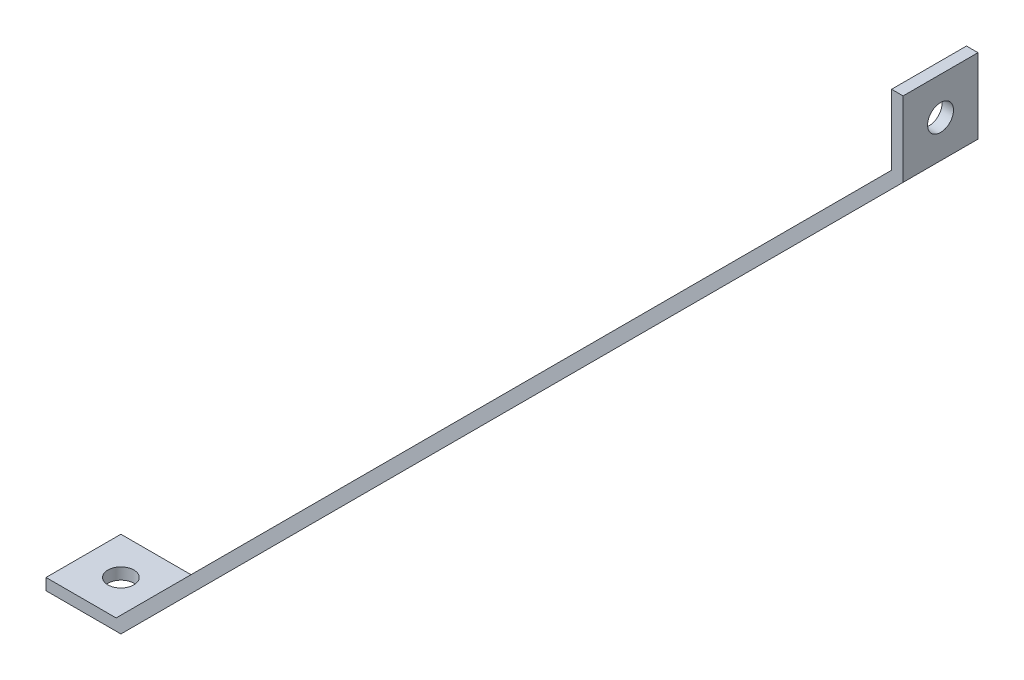
ISO-10303-21;
HEADER;
FILE_DESCRIPTION(('STEP AP214'),'2;1');
FILE_NAME('part.step','',(''),(''),'','','');
FILE_SCHEMA(('AUTOMOTIVE_DESIGN { 1 0 10303 214 1 1 1 1 }'));
ENDSEC;
DATA;
#1=APPLICATION_CONTEXT('core data for automotive mechanical design processes');
#2=APPLICATION_PROTOCOL_DEFINITION('international standard','automotive_design',2000,#1);
#3=PRODUCT_CONTEXT('',#1,'mechanical');
#4=PRODUCT('Part','Part','',(#3));
#5=PRODUCT_RELATED_PRODUCT_CATEGORY('part','',(#4));
#6=PRODUCT_DEFINITION_FORMATION('','',#4);
#7=PRODUCT_DEFINITION_CONTEXT('part definition',#1,'design');
#8=PRODUCT_DEFINITION('design','',#6,#7);
#9=PRODUCT_DEFINITION_SHAPE('','',#8);
#10=(LENGTH_UNIT() NAMED_UNIT(*) SI_UNIT(.MILLI.,.METRE.));
#11=(NAMED_UNIT(*) PLANE_ANGLE_UNIT() SI_UNIT($,.RADIAN.));
#12=(NAMED_UNIT(*) SI_UNIT($,.STERADIAN.) SOLID_ANGLE_UNIT());
#13=UNCERTAINTY_MEASURE_WITH_UNIT(LENGTH_MEASURE(1.E-05),#10,'distance_accuracy_value','');
#14=(GEOMETRIC_REPRESENTATION_CONTEXT(3) GLOBAL_UNCERTAINTY_ASSIGNED_CONTEXT((#13)) GLOBAL_UNIT_ASSIGNED_CONTEXT((#10,
#11,#12)) REPRESENTATION_CONTEXT('',''));
#15=CARTESIAN_POINT('',(0.,0.,0.));
#16=DIRECTION('',(0.,0.,1.));
#17=DIRECTION('',(1.,0.,0.));
#18=AXIS2_PLACEMENT_3D('',#15,#16,#17);
#19=CARTESIAN_POINT('',(215.526146905661,215.52614690566,20.6374999999994));
#20=DIRECTION('',(-0.999999999999998,0.,0.));
#21=DIRECTION('',(0.,0.,1.));
#22=AXIS2_PLACEMENT_3D('',#19,#20,#21);
#23=PLANE('',#22);
#24=CARTESIAN_POINT('',(215.52614690566,236.163646905659,-4.44089209850063E-13));
#25=DIRECTION('',(-0.999999999999998,0.,0.));
#26=DIRECTION('',(0.,-0.999999999999998,0.));
#27=AXIS2_PLACEMENT_3D('',#24,#25,#26);
#28=CIRCLE('',#27,7.14374999999999);
#29=CARTESIAN_POINT('',(215.52614690566,229.019896905659,-4.44089209850061E-13));
#30=VERTEX_POINT('',#29);
#31=EDGE_CURVE('E180',#30,#30,#28,.T.);
#32=ORIENTED_EDGE('',*,*,#31,.T.);
#33=EDGE_LOOP('',(#32));
#34=FACE_BOUND('',#33,.T.);
#35=DIRECTION('',(0.,0.999999999999998,0.));
#36=VECTOR('',#35,1.);
#37=CARTESIAN_POINT('',(215.52614690566,215.526146905659,-20.6375000000003));
#38=LINE('',#37,#36);
#39=CARTESIAN_POINT('',(215.52614690566,215.526146905659,-20.6375000000003));
#40=VERTEX_POINT('',#39);
#41=CARTESIAN_POINT('',(215.52614690566,256.801146905659,-20.6375000000003));
#42=VERTEX_POINT('',#41);
#43=EDGE_CURVE('E129',#40,#42,#38,.T.);
#44=ORIENTED_EDGE('',*,*,#43,.T.);
#45=DIRECTION('',(0.,0.,-1.));
#46=VECTOR('',#45,1.);
#47=CARTESIAN_POINT('',(215.526146905661,256.801146905659,20.6374999999994));
#48=LINE('',#47,#46);
#49=CARTESIAN_POINT('',(215.526146905661,256.801146905659,20.6374999999994));
#50=VERTEX_POINT('',#49);
#51=EDGE_CURVE('E11',#50,#42,#48,.T.);
#52=ORIENTED_EDGE('',*,*,#51,.F.);
#53=DIRECTION('',(0.,0.999999999999998,0.));
#54=VECTOR('',#53,1.);
#55=CARTESIAN_POINT('',(215.526146905661,215.52614690566,20.6374999999994));
#56=LINE('',#55,#54);
#57=CARTESIAN_POINT('',(215.526146905661,215.52614690566,20.6374999999994));
#58=VERTEX_POINT('',#57);
#59=EDGE_CURVE('E87',#58,#50,#56,.T.);
#60=ORIENTED_EDGE('',*,*,#59,.F.);
#61=DIRECTION('',(0.,0.,-1.));
#62=VECTOR('',#61,1.);
#63=CARTESIAN_POINT('',(215.526146905661,215.52614690566,20.6374999999994));
#64=LINE('',#63,#62);
#65=EDGE_CURVE('E128',#58,#40,#64,.T.);
#66=ORIENTED_EDGE('',*,*,#65,.T.);
#67=EDGE_LOOP('',(#44,#52,#60,#66));
#68=FACE_BOUND('',#67,.T.);
#69=ADVANCED_FACE('F32',(#34,#68),#23,.F.);
#70=CARTESIAN_POINT('',(209.176146905661,256.801146905659,20.6374999999999));
#71=DIRECTION('',(0.,0.999999999999998,0.));
#72=DIRECTION('',(0.,0.,1.));
#73=AXIS2_PLACEMENT_3D('',#70,#71,#72);
#74=PLANE('',#73);
#75=DIRECTION('',(0.999999999999998,0.,0.));
#76=VECTOR('',#75,1.);
#77=CARTESIAN_POINT('',(209.176146905659,256.801146905659,-20.6375000000003));
#78=LINE('',#77,#76);
#79=CARTESIAN_POINT('',(209.176146905659,256.801146905659,-20.6375000000003));
#80=VERTEX_POINT('',#79);
#81=EDGE_CURVE('E132',#80,#42,#78,.T.);
#82=ORIENTED_EDGE('',*,*,#81,.F.);
#83=DIRECTION('',(0.,0.,-1.));
#84=VECTOR('',#83,1.);
#85=CARTESIAN_POINT('',(209.176146905661,256.801146905659,20.6374999999999));
#86=LINE('',#85,#84);
#87=CARTESIAN_POINT('',(209.176146905661,256.801146905659,20.6374999999999));
#88=VERTEX_POINT('',#87);
#89=EDGE_CURVE('E40',#88,#80,#86,.T.);
#90=ORIENTED_EDGE('',*,*,#89,.F.);
#91=DIRECTION('',(0.999999999999998,0.,0.));
#92=VECTOR('',#91,1.);
#93=CARTESIAN_POINT('',(209.176146905661,256.801146905659,20.6374999999999));
#94=LINE('',#93,#92);
#95=EDGE_CURVE('E172',#88,#50,#94,.T.);
#96=ORIENTED_EDGE('',*,*,#95,.T.);
#97=ORIENTED_EDGE('',*,*,#51,.T.);
#98=EDGE_LOOP('',(#82,#90,#96,#97));
#99=FACE_BOUND('',#98,.T.);
#100=ADVANCED_FACE('F163',(#99),#74,.T.);
#101=CARTESIAN_POINT('',(209.176146905661,215.52614690566,20.6374999999999));
#102=DIRECTION('',(-0.999999999999998,0.,0.));
#103=DIRECTION('',(0.,0.,1.));
#104=AXIS2_PLACEMENT_3D('',#101,#102,#103);
#105=PLANE('',#104);
#106=CARTESIAN_POINT('',(209.176146905659,236.163646905659,-4.44089209850063E-13));
#107=DIRECTION('',(-0.999999999999998,0.,0.));
#108=DIRECTION('',(0.,-0.999999999999998,0.));
#109=AXIS2_PLACEMENT_3D('',#106,#107,#108);
#110=CIRCLE('',#109,7.14374999999999);
#111=CARTESIAN_POINT('',(209.176146905659,229.019896905659,-4.44089209850061E-13));
#112=VERTEX_POINT('',#111);
#113=EDGE_CURVE('E183',#112,#112,#110,.T.);
#114=ORIENTED_EDGE('',*,*,#113,.F.);
#115=EDGE_LOOP('',(#114));
#116=FACE_BOUND('',#115,.T.);
#117=DIRECTION('',(0.,0.999999999999998,0.));
#118=VECTOR('',#117,1.);
#119=CARTESIAN_POINT('',(209.176146905659,215.526146905659,-20.6375000000003));
#120=LINE('',#119,#118);
#121=CARTESIAN_POINT('',(209.176146905659,218.156403026728,-20.6375000000003));
#122=VERTEX_POINT('',#121);
#123=EDGE_CURVE('E136',#122,#80,#120,.T.);
#124=ORIENTED_EDGE('',*,*,#123,.F.);
#125=DIRECTION('',(0.,0.,-1.));
#126=VECTOR('',#125,1.);
#127=CARTESIAN_POINT('',(209.176146905661,218.156403026729,20.6374999999999));
#128=LINE('',#127,#126);
#129=CARTESIAN_POINT('',(209.176146905661,218.156403026729,20.6374999999999));
#130=VERTEX_POINT('',#129);
#131=EDGE_CURVE('E153',#130,#122,#128,.T.);
#132=ORIENTED_EDGE('',*,*,#131,.F.);
#133=DIRECTION('',(0.,0.999999999999998,0.));
#134=VECTOR('',#133,1.);
#135=CARTESIAN_POINT('',(209.176146905661,215.52614690566,20.6374999999999));
#136=LINE('',#135,#134);
#137=EDGE_CURVE('E160',#130,#88,#136,.T.);
#138=ORIENTED_EDGE('',*,*,#137,.T.);
#139=ORIENTED_EDGE('',*,*,#89,.T.);
#140=EDGE_LOOP('',(#124,#132,#138,#139));
#141=FACE_BOUND('',#140,.T.);
#142=ADVANCED_FACE('F158',(#116,#141),#105,.T.);
#143=CARTESIAN_POINT('',(-220.016274966192,-211.036018845125,20.6374999999999));
#144=DIRECTION('',(-0.707106781186548,0.707106781186545,0.));
#145=DIRECTION('',(-0.707106781186545,-0.707106781186548,0.));
#146=AXIS2_PLACEMENT_3D('',#143,#144,#145);
#147=PLANE('',#146);
#148=DIRECTION('',(0.707106781186545,0.707106781186548,0.));
#149=VECTOR('',#148,1.);
#150=CARTESIAN_POINT('',(-220.016274966194,-211.036018845125,-20.6374999999999));
#151=LINE('',#150,#149);
#152=CARTESIAN_POINT('',(-218.156403026728,-209.17614690566,-20.6374999999994));
#153=VERTEX_POINT('',#152);
#154=EDGE_CURVE('E139',#153,#122,#151,.T.);
#155=ORIENTED_EDGE('',*,*,#154,.F.);
#156=DIRECTION('',(0.,0.,-1.));
#157=VECTOR('',#156,1.);
#158=CARTESIAN_POINT('',(-218.156403026727,-209.17614690566,20.6375000000003));
#159=LINE('',#158,#157);
#160=CARTESIAN_POINT('',(-218.156403026727,-209.17614690566,20.6375000000003));
#161=VERTEX_POINT('',#160);
#162=EDGE_CURVE('E151',#161,#153,#159,.T.);
#163=ORIENTED_EDGE('',*,*,#162,.F.);
#164=DIRECTION('',(0.707106781186545,0.707106781186548,0.));
#165=VECTOR('',#164,1.);
#166=CARTESIAN_POINT('',(-220.016274966192,-211.036018845125,20.6374999999999));
#167=LINE('',#166,#165);
#168=EDGE_CURVE('E123',#161,#130,#167,.T.);
#169=ORIENTED_EDGE('',*,*,#168,.T.);
#170=ORIENTED_EDGE('',*,*,#131,.T.);
#171=EDGE_LOOP('',(#155,#163,#169,#170));
#172=FACE_BOUND('',#171,.T.);
#173=ADVANCED_FACE('F170',(#172),#147,.T.);
#174=CARTESIAN_POINT('',(-256.801146905658,-209.17614690566,20.6375000000003));
#175=DIRECTION('',(0.,0.999999999999998,0.));
#176=DIRECTION('',(-0.999999999999998,0.,0.));
#177=AXIS2_PLACEMENT_3D('',#174,#175,#176);
#178=PLANE('',#177);
#179=CARTESIAN_POINT('',(-236.163646905659,-209.17614690566,-4.44089209850063E-13));
#180=DIRECTION('',(0.,0.999999999999998,0.));
#181=DIRECTION('',(0.,0.,1.));
#182=AXIS2_PLACEMENT_3D('',#179,#180,#181);
#183=CIRCLE('',#182,7.14375000000002);
#184=CARTESIAN_POINT('',(-236.163646905659,-209.17614690566,7.14374999999957));
#185=VERTEX_POINT('',#184);
#186=EDGE_CURVE('E177',#185,#185,#183,.T.);
#187=ORIENTED_EDGE('',*,*,#186,.F.);
#188=EDGE_LOOP('',(#187));
#189=FACE_BOUND('',#188,.T.);
#190=DIRECTION('',(0.999999999999998,0.,0.));
#191=VECTOR('',#190,1.);
#192=CARTESIAN_POINT('',(-256.801146905659,-209.17614690566,-20.6374999999999));
#193=LINE('',#192,#191);
#194=CARTESIAN_POINT('',(-256.801146905659,-209.17614690566,-20.6374999999999));
#195=VERTEX_POINT('',#194);
#196=EDGE_CURVE('E142',#195,#153,#193,.T.);
#197=ORIENTED_EDGE('',*,*,#196,.F.);
#198=DIRECTION('',(0.,0.,-1.));
#199=VECTOR('',#198,1.);
#200=CARTESIAN_POINT('',(-256.801146905658,-209.17614690566,20.6375000000003));
#201=LINE('',#200,#199);
#202=CARTESIAN_POINT('',(-256.801146905658,-209.17614690566,20.6375000000003));
#203=VERTEX_POINT('',#202);
#204=EDGE_CURVE('E111',#203,#195,#201,.T.);
#205=ORIENTED_EDGE('',*,*,#204,.F.);
#206=DIRECTION('',(0.999999999999998,0.,0.));
#207=VECTOR('',#206,1.);
#208=CARTESIAN_POINT('',(-256.801146905658,-209.17614690566,20.6375000000003));
#209=LINE('',#208,#207);
#210=EDGE_CURVE('E121',#203,#161,#209,.T.);
#211=ORIENTED_EDGE('',*,*,#210,.T.);
#212=ORIENTED_EDGE('',*,*,#162,.T.);
#213=EDGE_LOOP('',(#197,#205,#211,#212));
#214=FACE_BOUND('',#213,.T.);
#215=ADVANCED_FACE('F204',(#189,#214),#178,.T.);
#216=CARTESIAN_POINT('',(-256.801146905658,-215.52614690566,20.6375000000003));
#217=DIRECTION('',(-0.999999999999998,0.,0.));
#218=DIRECTION('',(0.,0.,1.));
#219=AXIS2_PLACEMENT_3D('',#216,#217,#218);
#220=PLANE('',#219);
#221=DIRECTION('',(0.,0.999999999999998,0.));
#222=VECTOR('',#221,1.);
#223=CARTESIAN_POINT('',(-256.801146905659,-215.52614690566,-20.6374999999999));
#224=LINE('',#223,#222);
#225=CARTESIAN_POINT('',(-256.801146905659,-215.52614690566,-20.6374999999999));
#226=VERTEX_POINT('',#225);
#227=EDGE_CURVE('E110',#226,#195,#224,.T.);
#228=ORIENTED_EDGE('',*,*,#227,.F.);
#229=DIRECTION('',(0.,0.,-1.));
#230=VECTOR('',#229,1.);
#231=CARTESIAN_POINT('',(-256.801146905658,-215.52614690566,20.6375000000003));
#232=LINE('',#231,#230);
#233=CARTESIAN_POINT('',(-256.801146905658,-215.52614690566,20.6375000000003));
#234=VERTEX_POINT('',#233);
#235=EDGE_CURVE('E104',#234,#226,#232,.T.);
#236=ORIENTED_EDGE('',*,*,#235,.F.);
#237=DIRECTION('',(0.,0.999999999999998,0.));
#238=VECTOR('',#237,1.);
#239=CARTESIAN_POINT('',(-256.801146905658,-215.52614690566,20.6375000000003));
#240=LINE('',#239,#238);
#241=EDGE_CURVE('E108',#234,#203,#240,.T.);
#242=ORIENTED_EDGE('',*,*,#241,.T.);
#243=ORIENTED_EDGE('',*,*,#204,.T.);
#244=EDGE_LOOP('',(#228,#236,#242,#243));
#245=FACE_BOUND('',#244,.T.);
#246=ADVANCED_FACE('F106',(#245),#220,.T.);
#247=CARTESIAN_POINT('',(-256.801146905658,-215.52614690566,20.6375000000003));
#248=DIRECTION('',(0.,0.999999999999998,0.));
#249=DIRECTION('',(-0.999999999999998,0.,0.));
#250=AXIS2_PLACEMENT_3D('',#247,#248,#249);
#251=PLANE('',#250);
#252=CARTESIAN_POINT('',(-236.163646905659,-215.52614690566,-4.44089209850063E-13));
#253=DIRECTION('',(0.,0.999999999999998,0.));
#254=DIRECTION('',(0.,0.,1.));
#255=AXIS2_PLACEMENT_3D('',#252,#253,#254);
#256=CIRCLE('',#255,7.14375000000002);
#257=CARTESIAN_POINT('',(-236.163646905659,-215.52614690566,7.14374999999957));
#258=VERTEX_POINT('',#257);
#259=EDGE_CURVE('E133',#258,#258,#256,.T.);
#260=ORIENTED_EDGE('',*,*,#259,.T.);
#261=EDGE_LOOP('',(#260));
#262=FACE_BOUND('',#261,.T.);
#263=DIRECTION('',(0.999999999999998,0.,0.));
#264=VECTOR('',#263,1.);
#265=CARTESIAN_POINT('',(-256.801146905659,-215.52614690566,-20.6374999999999));
#266=LINE('',#265,#264);
#267=CARTESIAN_POINT('',(-215.526146905659,-215.52614690566,-20.6374999999994));
#268=VERTEX_POINT('',#267);
#269=EDGE_CURVE('E75',#226,#268,#266,.T.);
#270=ORIENTED_EDGE('',*,*,#269,.T.);
#271=DIRECTION('',(0.,0.,-1.));
#272=VECTOR('',#271,1.);
#273=CARTESIAN_POINT('',(-215.526146905658,-215.52614690566,20.6375000000003));
#274=LINE('',#273,#272);
#275=CARTESIAN_POINT('',(-215.526146905658,-215.52614690566,20.6375000000003));
#276=VERTEX_POINT('',#275);
#277=EDGE_CURVE('E112',#276,#268,#274,.T.);
#278=ORIENTED_EDGE('',*,*,#277,.F.);
#279=DIRECTION('',(0.999999999999998,0.,0.));
#280=VECTOR('',#279,1.);
#281=CARTESIAN_POINT('',(-256.801146905658,-215.52614690566,20.6375000000003));
#282=LINE('',#281,#280);
#283=EDGE_CURVE('E114',#234,#276,#282,.T.);
#284=ORIENTED_EDGE('',*,*,#283,.F.);
#285=ORIENTED_EDGE('',*,*,#235,.T.);
#286=EDGE_LOOP('',(#270,#278,#284,#285));
#287=FACE_BOUND('',#286,.T.);
#288=ADVANCED_FACE('F115',(#262,#287),#251,.F.);
#289=CARTESIAN_POINT('',(-215.526146905658,-215.52614690566,20.6375000000003));
#290=DIRECTION('',(-0.707106781186548,0.707106781186545,0.));
#291=DIRECTION('',(-0.707106781186545,-0.707106781186548,0.));
#292=AXIS2_PLACEMENT_3D('',#289,#290,#291);
#293=PLANE('',#292);
#294=DIRECTION('',(0.707106781186545,0.707106781186548,0.));
#295=VECTOR('',#294,1.);
#296=CARTESIAN_POINT('',(-215.526146905659,-215.52614690566,-20.6374999999994));
#297=LINE('',#296,#295);
#298=EDGE_CURVE('E81',#268,#40,#297,.T.);
#299=ORIENTED_EDGE('',*,*,#298,.T.);
#300=ORIENTED_EDGE('',*,*,#65,.F.);
#301=DIRECTION('',(0.707106781186545,0.707106781186548,0.));
#302=VECTOR('',#301,1.);
#303=CARTESIAN_POINT('',(-215.526146905658,-215.52614690566,20.6375000000003));
#304=LINE('',#303,#302);
#305=EDGE_CURVE('E48',#276,#58,#304,.T.);
#306=ORIENTED_EDGE('',*,*,#305,.F.);
#307=ORIENTED_EDGE('',*,*,#277,.T.);
#308=EDGE_LOOP('',(#299,#300,#306,#307));
#309=FACE_BOUND('',#308,.T.);
#310=ADVANCED_FACE('F249',(#309),#293,.F.);
#311=CARTESIAN_POINT('',(215.526146905661,256.801146905659,20.6374999999994));
#312=DIRECTION('',(0.,0.,-1.));
#313=DIRECTION('',(-0.999999999999998,0.,0.));
#314=AXIS2_PLACEMENT_3D('',#311,#312,#313);
#315=PLANE('',#314);
#316=ORIENTED_EDGE('',*,*,#59,.T.);
#317=ORIENTED_EDGE('',*,*,#95,.F.);
#318=ORIENTED_EDGE('',*,*,#137,.F.);
#319=ORIENTED_EDGE('',*,*,#168,.F.);
#320=ORIENTED_EDGE('',*,*,#210,.F.);
#321=ORIENTED_EDGE('',*,*,#241,.F.);
#322=ORIENTED_EDGE('',*,*,#283,.T.);
#323=ORIENTED_EDGE('',*,*,#305,.T.);
#324=EDGE_LOOP('',(#316,#317,#318,#319,#320,#321,#322,#323));
#325=FACE_BOUND('',#324,.T.);
#326=ADVANCED_FACE('F118',(#325),#315,.F.);
#327=CARTESIAN_POINT('',(215.52614690566,256.801146905659,-20.6375000000003));
#328=DIRECTION('',(0.,0.,-1.));
#329=DIRECTION('',(-0.999999999999998,0.,0.));
#330=AXIS2_PLACEMENT_3D('',#327,#328,#329);
#331=PLANE('',#330);
#332=ORIENTED_EDGE('',*,*,#43,.F.);
#333=ORIENTED_EDGE('',*,*,#298,.F.);
#334=ORIENTED_EDGE('',*,*,#269,.F.);
#335=ORIENTED_EDGE('',*,*,#227,.T.);
#336=ORIENTED_EDGE('',*,*,#196,.T.);
#337=ORIENTED_EDGE('',*,*,#154,.T.);
#338=ORIENTED_EDGE('',*,*,#123,.T.);
#339=ORIENTED_EDGE('',*,*,#81,.T.);
#340=EDGE_LOOP('',(#332,#333,#334,#335,#336,#337,#338,#339));
#341=FACE_BOUND('',#340,.T.);
#342=ADVANCED_FACE('F166',(#341),#331,.T.);
#343=CARTESIAN_POINT('',(-236.163646905659,-215.52614690566,-4.44089209850063E-13));
#344=DIRECTION('',(0.,0.999999999999998,0.));
#345=DIRECTION('',(0.,0.,1.));
#346=AXIS2_PLACEMENT_3D('',#343,#344,#345);
#347=CYLINDRICAL_SURFACE('',#346,7.14375000000002);
#348=CARTESIAN_POINT('',(-236.163646905659,-215.52614690566,7.14374999999957));
#349=CARTESIAN_POINT('',(-236.163646905659,-215.460001072326,7.14374999999957));
#350=CARTESIAN_POINT('',(-236.163646905659,-215.393855238993,7.14374999999957));
#351=CARTESIAN_POINT('',(-236.163646905659,-215.261563572326,7.14374999999957));
#352=CARTESIAN_POINT('',(-236.163646905659,-215.195417738993,7.14374999999957));
#353=CARTESIAN_POINT('',(-236.163646905659,-215.063126072326,7.14374999999957));
#354=CARTESIAN_POINT('',(-236.163646905659,-214.996980238993,7.14374999999957));
#355=CARTESIAN_POINT('',(-236.163646905659,-214.864688572326,7.14374999999957));
#356=CARTESIAN_POINT('',(-236.163646905659,-214.798542738993,7.14374999999957));
#357=CARTESIAN_POINT('',(-236.163646905659,-214.666251072326,7.14374999999957));
#358=CARTESIAN_POINT('',(-236.163646905659,-214.600105238993,7.14374999999957));
#359=CARTESIAN_POINT('',(-236.163646905659,-214.467813572326,7.14374999999957));
#360=CARTESIAN_POINT('',(-236.163646905659,-214.401667738993,7.14374999999957));
#361=CARTESIAN_POINT('',(-236.163646905659,-214.269376072326,7.14374999999957));
#362=CARTESIAN_POINT('',(-236.163646905659,-214.203230238993,7.14374999999957));
#363=CARTESIAN_POINT('',(-236.163646905659,-214.070938572326,7.14374999999957));
#364=CARTESIAN_POINT('',(-236.163646905659,-214.004792738993,7.14374999999957));
#365=CARTESIAN_POINT('',(-236.163646905659,-213.872501072326,7.14374999999957));
#366=CARTESIAN_POINT('',(-236.163646905659,-213.806355238993,7.14374999999957));
#367=CARTESIAN_POINT('',(-236.163646905659,-213.674063572326,7.14374999999957));
#368=CARTESIAN_POINT('',(-236.163646905659,-213.607917738993,7.14374999999957));
#369=CARTESIAN_POINT('',(-236.163646905659,-213.475626072326,7.14374999999957));
#370=CARTESIAN_POINT('',(-236.163646905659,-213.409480238993,7.14374999999957));
#371=CARTESIAN_POINT('',(-236.163646905659,-213.277188572326,7.14374999999957));
#372=CARTESIAN_POINT('',(-236.163646905659,-213.211042738993,7.14374999999957));
#373=CARTESIAN_POINT('',(-236.163646905659,-213.078751072326,7.14374999999957));
#374=CARTESIAN_POINT('',(-236.163646905659,-213.012605238993,7.14374999999957));
#375=CARTESIAN_POINT('',(-236.163646905659,-212.880313572326,7.14374999999957));
#376=CARTESIAN_POINT('',(-236.163646905659,-212.814167738993,7.14374999999957));
#377=CARTESIAN_POINT('',(-236.163646905659,-212.681876072326,7.14374999999957));
#378=CARTESIAN_POINT('',(-236.163646905659,-212.615730238993,7.14374999999957));
#379=CARTESIAN_POINT('',(-236.163646905659,-212.483438572326,7.14374999999957));
#380=CARTESIAN_POINT('',(-236.163646905659,-212.417292738993,7.14374999999957));
#381=CARTESIAN_POINT('',(-236.163646905659,-212.285001072326,7.14374999999957));
#382=CARTESIAN_POINT('',(-236.163646905659,-212.218855238993,7.14374999999957));
#383=CARTESIAN_POINT('',(-236.163646905659,-212.086563572326,7.14374999999957));
#384=CARTESIAN_POINT('',(-236.163646905659,-212.020417738993,7.14374999999957));
#385=CARTESIAN_POINT('',(-236.163646905659,-211.888126072326,7.14374999999957));
#386=CARTESIAN_POINT('',(-236.163646905659,-211.821980238993,7.14374999999957));
#387=CARTESIAN_POINT('',(-236.163646905659,-211.689688572326,7.14374999999957));
#388=CARTESIAN_POINT('',(-236.163646905659,-211.623542738993,7.14374999999957));
#389=CARTESIAN_POINT('',(-236.163646905659,-211.491251072326,7.14374999999957));
#390=CARTESIAN_POINT('',(-236.163646905659,-211.425105238993,7.14374999999957));
#391=CARTESIAN_POINT('',(-236.163646905659,-211.292813572326,7.14374999999957));
#392=CARTESIAN_POINT('',(-236.163646905659,-211.226667738993,7.14374999999957));
#393=CARTESIAN_POINT('',(-236.163646905659,-211.094376072326,7.14374999999957));
#394=CARTESIAN_POINT('',(-236.163646905659,-211.028230238993,7.14374999999957));
#395=CARTESIAN_POINT('',(-236.163646905659,-210.895938572326,7.14374999999957));
#396=CARTESIAN_POINT('',(-236.163646905659,-210.829792738993,7.14374999999957));
#397=CARTESIAN_POINT('',(-236.163646905659,-210.697501072327,7.14374999999957));
#398=CARTESIAN_POINT('',(-236.163646905659,-210.631355238993,7.14374999999957));
#399=CARTESIAN_POINT('',(-236.163646905659,-210.499063572327,7.14374999999957));
#400=CARTESIAN_POINT('',(-236.163646905659,-210.432917738993,7.14374999999957));
#401=CARTESIAN_POINT('',(-236.163646905659,-210.300626072327,7.14374999999957));
#402=CARTESIAN_POINT('',(-236.163646905659,-210.234480238993,7.14374999999957));
#403=CARTESIAN_POINT('',(-236.163646905659,-210.102188572327,7.14374999999957));
#404=CARTESIAN_POINT('',(-236.163646905659,-210.036042738993,7.14374999999957));
#405=CARTESIAN_POINT('',(-236.163646905659,-209.903751072327,7.14374999999957));
#406=CARTESIAN_POINT('',(-236.163646905659,-209.837605238993,7.14374999999957));
#407=CARTESIAN_POINT('',(-236.163646905659,-209.705313572327,7.14374999999957));
#408=CARTESIAN_POINT('',(-236.163646905659,-209.639167738993,7.14374999999957));
#409=CARTESIAN_POINT('',(-236.163646905659,-209.506876072327,7.14374999999957));
#410=CARTESIAN_POINT('',(-236.163646905659,-209.440730238993,7.14374999999957));
#411=CARTESIAN_POINT('',(-236.163646905659,-209.308438572327,7.14374999999957));
#412=CARTESIAN_POINT('',(-236.163646905659,-209.242292738993,7.14374999999957));
#413=CARTESIAN_POINT('',(-236.163646905659,-209.17614690566,7.14374999999957));
#414=B_SPLINE_CURVE_WITH_KNOTS('',3,(#348,#349,#350,#351,#352,#353,#354,#355,#356,#357,#358,
#359,#360,#361,#362,#363,#364,#365,#366,#367,#368,#369,#370,#371,#372,#373,#374,#375,#376,#377,
#378,#379,#380,#381,#382,#383,#384,#385,#386,#387,#388,#389,#390,#391,#392,#393,#394,#395,#396,
#397,#398,#399,#400,#401,#402,#403,#404,#405,#406,#407,#408,#409,#410,#411,#412,#413),
.UNSPECIFIED.,.F.,.F.,(4,2,2,2,2,2,2,2,2,2,2,2,2,2,2,2,2,2,2,2,2,2,2,2,2,2,2,2,2,2,2,2,4),(0.,
0.198437499999982,0.396874999999991,0.595312499999973,0.793749999999982,0.992187499999964,
1.19062499999997,1.38906249999995,1.58749999999996,1.78593749999995,1.98437499999995,
2.18281249999994,2.38124999999992,2.57968749999993,2.77812499999994,2.97656249999992,
3.17499999999993,3.37343749999991,3.57187499999992,3.7703124999999,3.96874999999991,
4.16718749999989,4.3656249999999,4.56406249999988,4.76249999999986,4.96093749999987,
5.15937499999988,5.35781249999986,5.55624999999987,5.75468749999986,5.95312499999986,
6.15156249999985,6.34999999999986),.UNSPECIFIED.);
#415=EDGE_CURVE('BSEAM194',#258,#185,#414,.T.);
#416=ORIENTED_EDGE('',*,*,#259,.F.);
#417=ORIENTED_EDGE('',*,*,#186,.T.);
#418=ORIENTED_EDGE('',*,*,#415,.T.);
#419=ORIENTED_EDGE('',*,*,#415,.F.);
#420=EDGE_LOOP('',(#416,#418,#417,#419));
#421=FACE_BOUND('',#420,.T.);
#422=ADVANCED_FACE('F194',(#421),#347,.F.);
#423=CARTESIAN_POINT('',(215.52614690566,236.163646905659,-4.44089209850063E-13));
#424=DIRECTION('',(-0.999999999999998,0.,0.));
#425=DIRECTION('',(0.,-0.999999999999998,0.));
#426=AXIS2_PLACEMENT_3D('',#423,#424,#425);
#427=CYLINDRICAL_SURFACE('',#426,7.14374999999999);
#428=CARTESIAN_POINT('',(215.52614690566,229.019896905659,-4.44089209850061E-13));
#429=CARTESIAN_POINT('',(215.460001072326,229.019896905659,-4.44089209850061E-13));
#430=CARTESIAN_POINT('',(215.393855238993,229.019896905659,-4.44089209850061E-13));
#431=CARTESIAN_POINT('',(215.261563572326,229.019896905659,-4.44089209850061E-13));
#432=CARTESIAN_POINT('',(215.195417738993,229.019896905659,-4.44089209850061E-13));
#433=CARTESIAN_POINT('',(215.063126072326,229.019896905659,-4.44089209850061E-13));
#434=CARTESIAN_POINT('',(214.996980238993,229.019896905659,-4.44089209850061E-13));
#435=CARTESIAN_POINT('',(214.864688572326,229.019896905659,-4.44089209850061E-13));
#436=CARTESIAN_POINT('',(214.798542738993,229.019896905659,-4.44089209850061E-13));
#437=CARTESIAN_POINT('',(214.666251072326,229.019896905659,-4.44089209850061E-13));
#438=CARTESIAN_POINT('',(214.600105238993,229.019896905659,-4.44089209850061E-13));
#439=CARTESIAN_POINT('',(214.467813572326,229.019896905659,-4.44089209850061E-13));
#440=CARTESIAN_POINT('',(214.401667738993,229.019896905659,-4.44089209850061E-13));
#441=CARTESIAN_POINT('',(214.269376072326,229.019896905659,-4.44089209850061E-13));
#442=CARTESIAN_POINT('',(214.203230238993,229.019896905659,-4.44089209850061E-13));
#443=CARTESIAN_POINT('',(214.070938572326,229.019896905659,-4.44089209850061E-13));
#444=CARTESIAN_POINT('',(214.004792738993,229.019896905659,-4.44089209850061E-13));
#445=CARTESIAN_POINT('',(213.872501072326,229.019896905659,-4.44089209850061E-13));
#446=CARTESIAN_POINT('',(213.806355238993,229.019896905659,-4.44089209850061E-13));
#447=CARTESIAN_POINT('',(213.674063572326,229.019896905659,-4.44089209850061E-13));
#448=CARTESIAN_POINT('',(213.607917738993,229.019896905659,-4.44089209850061E-13));
#449=CARTESIAN_POINT('',(213.475626072326,229.019896905659,-4.44089209850061E-13));
#450=CARTESIAN_POINT('',(213.409480238993,229.019896905659,-4.44089209850061E-13));
#451=CARTESIAN_POINT('',(213.277188572326,229.019896905659,-4.44089209850061E-13));
#452=CARTESIAN_POINT('',(213.211042738993,229.019896905659,-4.44089209850061E-13));
#453=CARTESIAN_POINT('',(213.078751072326,229.019896905659,-4.44089209850061E-13));
#454=CARTESIAN_POINT('',(213.012605238993,229.019896905659,-4.44089209850061E-13));
#455=CARTESIAN_POINT('',(212.880313572326,229.019896905659,-4.44089209850061E-13));
#456=CARTESIAN_POINT('',(212.814167738993,229.019896905659,-4.44089209850061E-13));
#457=CARTESIAN_POINT('',(212.681876072326,229.019896905659,-4.44089209850061E-13));
#458=CARTESIAN_POINT('',(212.615730238993,229.019896905659,-4.44089209850061E-13));
#459=CARTESIAN_POINT('',(212.483438572326,229.019896905659,-4.44089209850061E-13));
#460=CARTESIAN_POINT('',(212.417292738993,229.019896905659,-4.44089209850061E-13));
#461=CARTESIAN_POINT('',(212.285001072326,229.019896905659,-4.44089209850061E-13));
#462=CARTESIAN_POINT('',(212.218855238993,229.019896905659,-4.44089209850061E-13));
#463=CARTESIAN_POINT('',(212.086563572326,229.019896905659,-4.44089209850061E-13));
#464=CARTESIAN_POINT('',(212.020417738993,229.019896905659,-4.44089209850061E-13));
#465=CARTESIAN_POINT('',(211.888126072326,229.019896905659,-4.44089209850061E-13));
#466=CARTESIAN_POINT('',(211.821980238993,229.019896905659,-4.44089209850061E-13));
#467=CARTESIAN_POINT('',(211.689688572326,229.019896905659,-4.44089209850061E-13));
#468=CARTESIAN_POINT('',(211.623542738993,229.019896905659,-4.44089209850061E-13));
#469=CARTESIAN_POINT('',(211.491251072326,229.019896905659,-4.44089209850061E-13));
#470=CARTESIAN_POINT('',(211.425105238993,229.019896905659,-4.44089209850061E-13));
#471=CARTESIAN_POINT('',(211.292813572326,229.019896905659,-4.44089209850061E-13));
#472=CARTESIAN_POINT('',(211.226667738993,229.019896905659,-4.44089209850061E-13));
#473=CARTESIAN_POINT('',(211.094376072326,229.019896905659,-4.44089209850061E-13));
#474=CARTESIAN_POINT('',(211.028230238993,229.019896905659,-4.44089209850061E-13));
#475=CARTESIAN_POINT('',(210.895938572326,229.019896905659,-4.44089209850061E-13));
#476=CARTESIAN_POINT('',(210.829792738993,229.019896905659,-4.44089209850061E-13));
#477=CARTESIAN_POINT('',(210.697501072326,229.019896905659,-4.44089209850061E-13));
#478=CARTESIAN_POINT('',(210.631355238993,229.019896905659,-4.44089209850061E-13));
#479=CARTESIAN_POINT('',(210.499063572326,229.019896905659,-4.44089209850061E-13));
#480=CARTESIAN_POINT('',(210.432917738993,229.019896905659,-4.44089209850061E-13));
#481=CARTESIAN_POINT('',(210.300626072326,229.019896905659,-4.44089209850061E-13));
#482=CARTESIAN_POINT('',(210.234480238993,229.019896905659,-4.44089209850061E-13));
#483=CARTESIAN_POINT('',(210.102188572326,229.019896905659,-4.44089209850061E-13));
#484=CARTESIAN_POINT('',(210.036042738993,229.019896905659,-4.44089209850061E-13));
#485=CARTESIAN_POINT('',(209.903751072326,229.019896905659,-4.44089209850061E-13));
#486=CARTESIAN_POINT('',(209.837605238993,229.019896905659,-4.44089209850061E-13));
#487=CARTESIAN_POINT('',(209.705313572326,229.019896905659,-4.44089209850061E-13));
#488=CARTESIAN_POINT('',(209.639167738993,229.019896905659,-4.44089209850061E-13));
#489=CARTESIAN_POINT('',(209.506876072326,229.019896905659,-4.44089209850061E-13));
#490=CARTESIAN_POINT('',(209.440730238993,229.019896905659,-4.44089209850061E-13));
#491=CARTESIAN_POINT('',(209.308438572326,229.019896905659,-4.44089209850061E-13));
#492=CARTESIAN_POINT('',(209.242292738993,229.019896905659,-4.44089209850061E-13));
#493=CARTESIAN_POINT('',(209.176146905659,229.019896905659,-4.44089209850061E-13));
#494=B_SPLINE_CURVE_WITH_KNOTS('',3,(#428,#429,#430,#431,#432,#433,#434,#435,#436,#437,#438,
#439,#440,#441,#442,#443,#444,#445,#446,#447,#448,#449,#450,#451,#452,#453,#454,#455,#456,#457,
#458,#459,#460,#461,#462,#463,#464,#465,#466,#467,#468,#469,#470,#471,#472,#473,#474,#475,#476,
#477,#478,#479,#480,#481,#482,#483,#484,#485,#486,#487,#488,#489,#490,#491,#492,#493),
.UNSPECIFIED.,.F.,.F.,(4,2,2,2,2,2,2,2,2,2,2,2,2,2,2,2,2,2,2,2,2,2,2,2,2,2,2,2,2,2,2,2,4),(0.,
0.198437500000009,0.396875000000019,0.595312500000028,0.793750000000037,0.992187500000047,
1.19062500000003,1.38906250000007,1.58750000000007,1.78593750000008,1.98437500000009,
2.1828125000001,2.38125000000008,2.57968750000012,2.77812500000013,2.97656250000014,
3.17500000000015,3.37343750000016,3.57187500000017,3.77031250000018,3.96875000000019,
4.1671875000002,4.36562500000021,4.56406250000022,4.7625000000002,4.96093750000023,
5.15937500000022,5.35781250000025,5.55625000000026,5.75468750000027,5.95312500000028,
6.15156250000029,6.3500000000003),.UNSPECIFIED.);
#495=EDGE_CURVE('BSEAM191',#30,#112,#494,.T.);
#496=ORIENTED_EDGE('',*,*,#31,.F.);
#497=ORIENTED_EDGE('',*,*,#113,.T.);
#498=ORIENTED_EDGE('',*,*,#495,.T.);
#499=ORIENTED_EDGE('',*,*,#495,.F.);
#500=EDGE_LOOP('',(#496,#498,#497,#499));
#501=FACE_BOUND('',#500,.T.);
#502=ADVANCED_FACE('F191',(#501),#427,.F.);
#503=CLOSED_SHELL('',(#69,#100,#142,#173,#215,#246,#288,#310,#326,#342,#422,#502));
#504=MANIFOLD_SOLID_BREP('B2',#503);
#505=ADVANCED_BREP_SHAPE_REPRESENTATION('',(#18,#504),#14);
#506=SHAPE_DEFINITION_REPRESENTATION(#9,#505);
ENDSEC;
END-ISO-10303-21;
